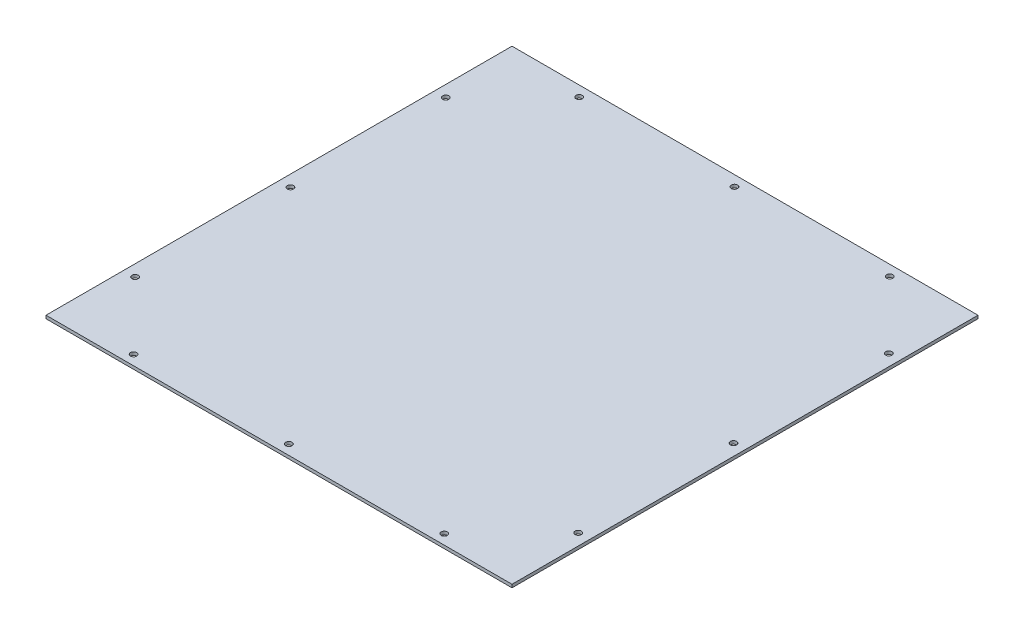
ISO-10303-21;
HEADER;
FILE_DESCRIPTION(('STEP AP214'),'2;1');
FILE_NAME('part.step','',(''),(''),'','','');
FILE_SCHEMA(('AUTOMOTIVE_DESIGN { 1 0 10303 214 1 1 1 1 }'));
ENDSEC;
DATA;
#1=APPLICATION_CONTEXT('core data for automotive mechanical design processes');
#2=APPLICATION_PROTOCOL_DEFINITION('international standard','automotive_design',2000,#1);
#3=PRODUCT_CONTEXT('',#1,'mechanical');
#4=PRODUCT('Part','Part','',(#3));
#5=PRODUCT_RELATED_PRODUCT_CATEGORY('part','',(#4));
#6=PRODUCT_DEFINITION_FORMATION('','',#4);
#7=PRODUCT_DEFINITION_CONTEXT('part definition',#1,'design');
#8=PRODUCT_DEFINITION('design','',#6,#7);
#9=PRODUCT_DEFINITION_SHAPE('','',#8);
#10=(LENGTH_UNIT() NAMED_UNIT(*) SI_UNIT(.MILLI.,.METRE.));
#11=(NAMED_UNIT(*) PLANE_ANGLE_UNIT() SI_UNIT($,.RADIAN.));
#12=(NAMED_UNIT(*) SI_UNIT($,.STERADIAN.) SOLID_ANGLE_UNIT());
#13=UNCERTAINTY_MEASURE_WITH_UNIT(LENGTH_MEASURE(1.E-05),#10,'distance_accuracy_value','');
#14=(GEOMETRIC_REPRESENTATION_CONTEXT(3) GLOBAL_UNCERTAINTY_ASSIGNED_CONTEXT((#13)) GLOBAL_UNIT_ASSIGNED_CONTEXT((#10,
#11,#12)) REPRESENTATION_CONTEXT('',''));
#15=CARTESIAN_POINT('',(0.,0.,0.));
#16=DIRECTION('',(0.,0.,1.));
#17=DIRECTION('',(1.,0.,0.));
#18=AXIS2_PLACEMENT_3D('',#15,#16,#17);
#19=CARTESIAN_POINT('',(-225.,3.,225.));
#20=DIRECTION('',(1.,0.,0.));
#21=DIRECTION('',(0.,0.,1.));
#22=AXIS2_PLACEMENT_3D('',#19,#20,#21);
#23=PLANE('',#22);
#24=DIRECTION('',(0.,1.,0.));
#25=VECTOR('',#24,1.);
#26=CARTESIAN_POINT('',(-225.,3.,-225.));
#27=LINE('',#26,#25);
#28=CARTESIAN_POINT('',(-225.,0.,-225.));
#29=VERTEX_POINT('',#28);
#30=CARTESIAN_POINT('',(-225.,3.,-225.));
#31=VERTEX_POINT('',#30);
#32=EDGE_CURVE('E11',#29,#31,#27,.T.);
#33=ORIENTED_EDGE('',*,*,#32,.F.);
#34=DIRECTION('',(0.,0.,-1.));
#35=VECTOR('',#34,1.);
#36=CARTESIAN_POINT('',(-225.,0.,0.));
#37=LINE('',#36,#35);
#38=CARTESIAN_POINT('',(-225.,0.,225.));
#39=VERTEX_POINT('',#38);
#40=EDGE_CURVE('E93',#29,#39,#37,.F.);
#41=ORIENTED_EDGE('',*,*,#40,.T.);
#42=DIRECTION('',(0.,1.,0.));
#43=VECTOR('',#42,1.);
#44=CARTESIAN_POINT('',(-225.,3.,225.));
#45=LINE('',#44,#43);
#46=CARTESIAN_POINT('',(-225.,3.,225.));
#47=VERTEX_POINT('',#46);
#48=EDGE_CURVE('E49',#39,#47,#45,.T.);
#49=ORIENTED_EDGE('',*,*,#48,.T.);
#50=DIRECTION('',(0.,0.,1.));
#51=VECTOR('',#50,1.);
#52=CARTESIAN_POINT('',(-225.,3.,225.));
#53=LINE('',#52,#51);
#54=EDGE_CURVE('E110',#31,#47,#53,.T.);
#55=ORIENTED_EDGE('',*,*,#54,.F.);
#56=EDGE_LOOP('',(#33,#41,#49,#55));
#57=FACE_BOUND('',#56,.T.);
#58=ADVANCED_FACE('F39',(#57),#23,.F.);
#59=CARTESIAN_POINT('',(-225.,3.,225.));
#60=DIRECTION('',(0.,0.,-1.));
#61=DIRECTION('',(1.,0.,0.));
#62=AXIS2_PLACEMENT_3D('',#59,#60,#61);
#63=PLANE('',#62);
#64=ORIENTED_EDGE('',*,*,#48,.F.);
#65=DIRECTION('',(1.,0.,0.));
#66=VECTOR('',#65,1.);
#67=CARTESIAN_POINT('',(0.,0.,225.));
#68=LINE('',#67,#66);
#69=CARTESIAN_POINT('',(225.,0.,225.));
#70=VERTEX_POINT('',#69);
#71=EDGE_CURVE('E104',#39,#70,#68,.T.);
#72=ORIENTED_EDGE('',*,*,#71,.T.);
#73=DIRECTION('',(0.,1.,0.));
#74=VECTOR('',#73,1.);
#75=CARTESIAN_POINT('',(225.,3.,225.));
#76=LINE('',#75,#74);
#77=CARTESIAN_POINT('',(225.,3.,225.));
#78=VERTEX_POINT('',#77);
#79=EDGE_CURVE('E57',#70,#78,#76,.T.);
#80=ORIENTED_EDGE('',*,*,#79,.T.);
#81=DIRECTION('',(1.,0.,0.));
#82=VECTOR('',#81,1.);
#83=CARTESIAN_POINT('',(-225.,3.,225.));
#84=LINE('',#83,#82);
#85=EDGE_CURVE('E87',#47,#78,#84,.T.);
#86=ORIENTED_EDGE('',*,*,#85,.F.);
#87=EDGE_LOOP('',(#64,#72,#80,#86));
#88=FACE_BOUND('',#87,.T.);
#89=ADVANCED_FACE('F114',(#88),#63,.F.);
#90=CARTESIAN_POINT('',(225.,3.,225.));
#91=DIRECTION('',(-1.,0.,0.));
#92=DIRECTION('',(0.,0.,-1.));
#93=AXIS2_PLACEMENT_3D('',#90,#91,#92);
#94=PLANE('',#93);
#95=ORIENTED_EDGE('',*,*,#79,.F.);
#96=DIRECTION('',(0.,0.,-1.));
#97=VECTOR('',#96,1.);
#98=CARTESIAN_POINT('',(225.,0.,0.));
#99=LINE('',#98,#97);
#100=CARTESIAN_POINT('',(225.,0.,-225.));
#101=VERTEX_POINT('',#100);
#102=EDGE_CURVE('E92',#70,#101,#99,.T.);
#103=ORIENTED_EDGE('',*,*,#102,.T.);
#104=DIRECTION('',(0.,1.,0.));
#105=VECTOR('',#104,1.);
#106=CARTESIAN_POINT('',(225.,3.,-225.));
#107=LINE('',#106,#105);
#108=CARTESIAN_POINT('',(225.,3.,-225.));
#109=VERTEX_POINT('',#108);
#110=EDGE_CURVE('E43',#101,#109,#107,.T.);
#111=ORIENTED_EDGE('',*,*,#110,.T.);
#112=DIRECTION('',(0.,0.,-1.));
#113=VECTOR('',#112,1.);
#114=CARTESIAN_POINT('',(225.,3.,225.));
#115=LINE('',#114,#113);
#116=EDGE_CURVE('E106',#78,#109,#115,.T.);
#117=ORIENTED_EDGE('',*,*,#116,.F.);
#118=EDGE_LOOP('',(#95,#103,#111,#117));
#119=FACE_BOUND('',#118,.T.);
#120=ADVANCED_FACE('F95',(#119),#94,.F.);
#121=CARTESIAN_POINT('',(-225.,3.,-225.));
#122=DIRECTION('',(0.,0.,1.));
#123=DIRECTION('',(-1.,0.,0.));
#124=AXIS2_PLACEMENT_3D('',#121,#122,#123);
#125=PLANE('',#124);
#126=DIRECTION('',(1.,0.,0.));
#127=VECTOR('',#126,1.);
#128=CARTESIAN_POINT('',(0.,0.,-225.));
#129=LINE('',#128,#127);
#130=EDGE_CURVE('E81',#101,#29,#129,.F.);
#131=ORIENTED_EDGE('',*,*,#130,.T.);
#132=ORIENTED_EDGE('',*,*,#32,.T.);
#133=DIRECTION('',(-1.,0.,0.));
#134=VECTOR('',#133,1.);
#135=CARTESIAN_POINT('',(-225.,3.,-225.));
#136=LINE('',#135,#134);
#137=EDGE_CURVE('E83',#109,#31,#136,.T.);
#138=ORIENTED_EDGE('',*,*,#137,.F.);
#139=ORIENTED_EDGE('',*,*,#110,.F.);
#140=EDGE_LOOP('',(#131,#132,#138,#139));
#141=FACE_BOUND('',#140,.T.);
#142=ADVANCED_FACE('F41',(#141),#125,.F.);
#143=CARTESIAN_POINT('',(0.,3.,0.));
#144=DIRECTION('',(0.,-1.,0.));
#145=DIRECTION('',(0.,0.,-1.));
#146=AXIS2_PLACEMENT_3D('',#143,#144,#145);
#147=PLANE('',#146);
#148=CARTESIAN_POINT('',(-213.95,3.,-150.));
#149=DIRECTION('',(0.,1.,0.));
#150=DIRECTION('',(0.,0.,-1.));
#151=AXIS2_PLACEMENT_3D('',#148,#149,#150);
#152=CIRCLE('',#151,2.99999999999999);
#153=CARTESIAN_POINT('',(-213.95,3.,-153.));
#154=VERTEX_POINT('',#153);
#155=EDGE_CURVE('E246',#154,#154,#152,.T.);
#156=ORIENTED_EDGE('',*,*,#155,.F.);
#157=EDGE_LOOP('',(#156));
#158=FACE_BOUND('',#157,.T.);
#159=CARTESIAN_POINT('',(-213.94999960393,3.,0.));
#160=DIRECTION('',(0.,1.,0.));
#161=DIRECTION('',(0.,0.,-1.));
#162=AXIS2_PLACEMENT_3D('',#159,#160,#161);
#163=CIRCLE('',#162,2.99999999999999);
#164=CARTESIAN_POINT('',(-213.94999960393,3.,-3.00000000000002));
#165=VERTEX_POINT('',#164);
#166=EDGE_CURVE('E240',#165,#165,#163,.T.);
#167=ORIENTED_EDGE('',*,*,#166,.F.);
#168=EDGE_LOOP('',(#167));
#169=FACE_BOUND('',#168,.T.);
#170=CARTESIAN_POINT('',(-213.949999801965,3.,150.));
#171=DIRECTION('',(0.,1.,0.));
#172=DIRECTION('',(0.,0.,-1.));
#173=AXIS2_PLACEMENT_3D('',#170,#171,#172);
#174=CIRCLE('',#173,2.99999999999999);
#175=CARTESIAN_POINT('',(-213.949999801965,3.,147.));
#176=VERTEX_POINT('',#175);
#177=EDGE_CURVE('E234',#176,#176,#174,.T.);
#178=ORIENTED_EDGE('',*,*,#177,.F.);
#179=EDGE_LOOP('',(#178));
#180=FACE_BOUND('',#179,.T.);
#181=CARTESIAN_POINT('',(0.,3.,-214.83));
#182=DIRECTION('',(0.,1.,0.));
#183=DIRECTION('',(0.,0.,1.));
#184=AXIS2_PLACEMENT_3D('',#181,#182,#183);
#185=CIRCLE('',#184,3.);
#186=CARTESIAN_POINT('',(0.,3.,-211.83));
#187=VERTEX_POINT('',#186);
#188=EDGE_CURVE('E212',#187,#187,#185,.T.);
#189=ORIENTED_EDGE('',*,*,#188,.F.);
#190=EDGE_LOOP('',(#189));
#191=FACE_BOUND('',#190,.T.);
#192=CARTESIAN_POINT('',(150.,3.,-214.83));
#193=DIRECTION('',(0.,1.,0.));
#194=DIRECTION('',(0.,0.,1.));
#195=AXIS2_PLACEMENT_3D('',#192,#193,#194);
#196=CIRCLE('',#195,2.99999999999999);
#197=CARTESIAN_POINT('',(150.,3.,-211.83));
#198=VERTEX_POINT('',#197);
#199=EDGE_CURVE('E218',#198,#198,#196,.T.);
#200=ORIENTED_EDGE('',*,*,#199,.F.);
#201=EDGE_LOOP('',(#200));
#202=FACE_BOUND('',#201,.T.);
#203=CARTESIAN_POINT('',(150.,3.,215.42));
#204=DIRECTION('',(0.,1.,0.));
#205=DIRECTION('',(0.,0.,-1.));
#206=AXIS2_PLACEMENT_3D('',#203,#204,#205);
#207=CIRCLE('',#206,2.99999999999999);
#208=CARTESIAN_POINT('',(150.,3.,212.42));
#209=VERTEX_POINT('',#208);
#210=EDGE_CURVE('E224',#209,#209,#207,.T.);
#211=ORIENTED_EDGE('',*,*,#210,.F.);
#212=EDGE_LOOP('',(#211));
#213=FACE_BOUND('',#212,.T.);
#214=CARTESIAN_POINT('',(-4.16333634234434E-13,3.,215.420006428616));
#215=DIRECTION('',(0.,1.,0.));
#216=DIRECTION('',(0.,0.,-1.));
#217=AXIS2_PLACEMENT_3D('',#214,#215,#216);
#218=CIRCLE('',#217,3.);
#219=CARTESIAN_POINT('',(-4.16333634234434E-13,3.,212.420006428616));
#220=VERTEX_POINT('',#219);
#221=EDGE_CURVE('E200',#220,#220,#218,.T.);
#222=ORIENTED_EDGE('',*,*,#221,.F.);
#223=EDGE_LOOP('',(#222));
#224=FACE_BOUND('',#223,.T.);
#225=CARTESIAN_POINT('',(213.949999998453,3.,150.));
#226=DIRECTION('',(0.,1.,0.));
#227=DIRECTION('',(0.,0.,1.));
#228=AXIS2_PLACEMENT_3D('',#225,#226,#227);
#229=CIRCLE('',#228,2.99999999999999);
#230=CARTESIAN_POINT('',(213.949999998453,3.,153.));
#231=VERTEX_POINT('',#230);
#232=EDGE_CURVE('E191',#231,#231,#229,.T.);
#233=ORIENTED_EDGE('',*,*,#232,.F.);
#234=EDGE_LOOP('',(#233));
#235=FACE_BOUND('',#234,.T.);
#236=CARTESIAN_POINT('',(213.949999998453,3.,0.));
#237=DIRECTION('',(0.,1.,0.));
#238=DIRECTION('',(0.,0.,1.));
#239=AXIS2_PLACEMENT_3D('',#236,#237,#238);
#240=CIRCLE('',#239,2.99999999999999);
#241=CARTESIAN_POINT('',(213.949999998453,3.,2.99999999999997));
#242=VERTEX_POINT('',#241);
#243=EDGE_CURVE('E184',#242,#242,#240,.T.);
#244=ORIENTED_EDGE('',*,*,#243,.F.);
#245=EDGE_LOOP('',(#244));
#246=FACE_BOUND('',#245,.T.);
#247=CARTESIAN_POINT('',(213.95,3.,-150.));
#248=DIRECTION('',(0.,1.,0.));
#249=DIRECTION('',(0.,0.,1.));
#250=AXIS2_PLACEMENT_3D('',#247,#248,#249);
#251=CIRCLE('',#250,2.99999999999999);
#252=CARTESIAN_POINT('',(213.95,3.,-147.));
#253=VERTEX_POINT('',#252);
#254=EDGE_CURVE('E188',#253,#253,#251,.T.);
#255=ORIENTED_EDGE('',*,*,#254,.F.);
#256=EDGE_LOOP('',(#255));
#257=FACE_BOUND('',#256,.T.);
#258=CARTESIAN_POINT('',(-150.,3.,215.420006428616));
#259=DIRECTION('',(0.,1.,0.));
#260=DIRECTION('',(0.,0.,-1.));
#261=AXIS2_PLACEMENT_3D('',#258,#259,#260);
#262=CIRCLE('',#261,2.99999999999999);
#263=CARTESIAN_POINT('',(-150.,3.,212.420006428616));
#264=VERTEX_POINT('',#263);
#265=EDGE_CURVE('E201',#264,#264,#262,.T.);
#266=ORIENTED_EDGE('',*,*,#265,.F.);
#267=EDGE_LOOP('',(#266));
#268=FACE_BOUND('',#267,.T.);
#269=CARTESIAN_POINT('',(-150.,3.,-214.83));
#270=DIRECTION('',(0.,1.,0.));
#271=DIRECTION('',(0.,0.,1.));
#272=AXIS2_PLACEMENT_3D('',#269,#270,#271);
#273=CIRCLE('',#272,2.99999999999999);
#274=CARTESIAN_POINT('',(-150.,3.,-211.83));
#275=VERTEX_POINT('',#274);
#276=EDGE_CURVE('E99',#275,#275,#273,.T.);
#277=ORIENTED_EDGE('',*,*,#276,.F.);
#278=EDGE_LOOP('',(#277));
#279=FACE_BOUND('',#278,.T.);
#280=ORIENTED_EDGE('',*,*,#116,.T.);
#281=ORIENTED_EDGE('',*,*,#137,.T.);
#282=ORIENTED_EDGE('',*,*,#54,.T.);
#283=ORIENTED_EDGE('',*,*,#85,.T.);
#284=EDGE_LOOP('',(#280,#281,#282,#283));
#285=FACE_BOUND('',#284,.T.);
#286=ADVANCED_FACE('F113',(#158,#169,#180,#191,#202,#213,#224,#235,#246,#257,#268,#279,#285),
#147,.F.);
#287=CARTESIAN_POINT('',(0.,0.,0.));
#288=DIRECTION('',(0.,-1.,0.));
#289=DIRECTION('',(0.,0.,-1.));
#290=AXIS2_PLACEMENT_3D('',#287,#288,#289);
#291=PLANE('',#290);
#292=CARTESIAN_POINT('',(-213.95,0.,-150.));
#293=DIRECTION('',(0.,1.,0.));
#294=DIRECTION('',(0.,0.,-1.));
#295=AXIS2_PLACEMENT_3D('',#292,#293,#294);
#296=CIRCLE('',#295,2.99999999999999);
#297=CARTESIAN_POINT('',(-213.95,0.,-153.));
#298=VERTEX_POINT('',#297);
#299=EDGE_CURVE('E243',#298,#298,#296,.T.);
#300=ORIENTED_EDGE('',*,*,#299,.T.);
#301=EDGE_LOOP('',(#300));
#302=FACE_BOUND('',#301,.T.);
#303=CARTESIAN_POINT('',(-213.94999960393,0.,0.));
#304=DIRECTION('',(0.,1.,0.));
#305=DIRECTION('',(0.,0.,-1.));
#306=AXIS2_PLACEMENT_3D('',#303,#304,#305);
#307=CIRCLE('',#306,2.99999999999999);
#308=CARTESIAN_POINT('',(-213.94999960393,0.,-3.00000000000002));
#309=VERTEX_POINT('',#308);
#310=EDGE_CURVE('E237',#309,#309,#307,.T.);
#311=ORIENTED_EDGE('',*,*,#310,.T.);
#312=EDGE_LOOP('',(#311));
#313=FACE_BOUND('',#312,.T.);
#314=CARTESIAN_POINT('',(-213.949999801965,0.,150.));
#315=DIRECTION('',(0.,1.,0.));
#316=DIRECTION('',(0.,0.,-1.));
#317=AXIS2_PLACEMENT_3D('',#314,#315,#316);
#318=CIRCLE('',#317,2.99999999999999);
#319=CARTESIAN_POINT('',(-213.949999801965,0.,147.));
#320=VERTEX_POINT('',#319);
#321=EDGE_CURVE('E196',#320,#320,#318,.T.);
#322=ORIENTED_EDGE('',*,*,#321,.T.);
#323=EDGE_LOOP('',(#322));
#324=FACE_BOUND('',#323,.T.);
#325=CARTESIAN_POINT('',(0.,0.,-214.83));
#326=DIRECTION('',(0.,1.,0.));
#327=DIRECTION('',(0.,0.,1.));
#328=AXIS2_PLACEMENT_3D('',#325,#326,#327);
#329=CIRCLE('',#328,3.);
#330=CARTESIAN_POINT('',(0.,0.,-211.83));
#331=VERTEX_POINT('',#330);
#332=EDGE_CURVE('E209',#331,#331,#329,.T.);
#333=ORIENTED_EDGE('',*,*,#332,.T.);
#334=EDGE_LOOP('',(#333));
#335=FACE_BOUND('',#334,.T.);
#336=CARTESIAN_POINT('',(150.,0.,-214.83));
#337=DIRECTION('',(0.,1.,0.));
#338=DIRECTION('',(0.,0.,1.));
#339=AXIS2_PLACEMENT_3D('',#336,#337,#338);
#340=CIRCLE('',#339,2.99999999999999);
#341=CARTESIAN_POINT('',(150.,0.,-211.83));
#342=VERTEX_POINT('',#341);
#343=EDGE_CURVE('E215',#342,#342,#340,.T.);
#344=ORIENTED_EDGE('',*,*,#343,.T.);
#345=EDGE_LOOP('',(#344));
#346=FACE_BOUND('',#345,.T.);
#347=CARTESIAN_POINT('',(150.,0.,215.42));
#348=DIRECTION('',(0.,1.,0.));
#349=DIRECTION('',(0.,0.,-1.));
#350=AXIS2_PLACEMENT_3D('',#347,#348,#349);
#351=CIRCLE('',#350,2.99999999999999);
#352=CARTESIAN_POINT('',(150.,0.,212.42));
#353=VERTEX_POINT('',#352);
#354=EDGE_CURVE('E221',#353,#353,#351,.T.);
#355=ORIENTED_EDGE('',*,*,#354,.T.);
#356=EDGE_LOOP('',(#355));
#357=FACE_BOUND('',#356,.T.);
#358=CARTESIAN_POINT('',(-4.16333634234434E-13,0.,215.420006428616));
#359=DIRECTION('',(0.,1.,0.));
#360=DIRECTION('',(0.,0.,-1.));
#361=AXIS2_PLACEMENT_3D('',#358,#359,#360);
#362=CIRCLE('',#361,3.);
#363=CARTESIAN_POINT('',(-4.16333634234434E-13,0.,212.420006428616));
#364=VERTEX_POINT('',#363);
#365=EDGE_CURVE('E227',#364,#364,#362,.T.);
#366=ORIENTED_EDGE('',*,*,#365,.T.);
#367=EDGE_LOOP('',(#366));
#368=FACE_BOUND('',#367,.T.);
#369=CARTESIAN_POINT('',(213.949999998453,0.,150.));
#370=DIRECTION('',(0.,1.,0.));
#371=DIRECTION('',(0.,0.,1.));
#372=AXIS2_PLACEMENT_3D('',#369,#370,#371);
#373=CIRCLE('',#372,2.99999999999999);
#374=CARTESIAN_POINT('',(213.949999998453,0.,153.));
#375=VERTEX_POINT('',#374);
#376=EDGE_CURVE('E186',#375,#375,#373,.T.);
#377=ORIENTED_EDGE('',*,*,#376,.T.);
#378=EDGE_LOOP('',(#377));
#379=FACE_BOUND('',#378,.T.);
#380=CARTESIAN_POINT('',(213.949999998453,0.,0.));
#381=DIRECTION('',(0.,1.,0.));
#382=DIRECTION('',(0.,0.,1.));
#383=AXIS2_PLACEMENT_3D('',#380,#381,#382);
#384=CIRCLE('',#383,2.99999999999999);
#385=CARTESIAN_POINT('',(213.949999998453,0.,2.99999999999997));
#386=VERTEX_POINT('',#385);
#387=EDGE_CURVE('E181',#386,#386,#384,.T.);
#388=ORIENTED_EDGE('',*,*,#387,.T.);
#389=EDGE_LOOP('',(#388));
#390=FACE_BOUND('',#389,.T.);
#391=CARTESIAN_POINT('',(213.95,0.,-150.));
#392=DIRECTION('',(0.,1.,0.));
#393=DIRECTION('',(0.,0.,1.));
#394=AXIS2_PLACEMENT_3D('',#391,#392,#393);
#395=CIRCLE('',#394,2.99999999999999);
#396=CARTESIAN_POINT('',(213.95,0.,-147.));
#397=VERTEX_POINT('',#396);
#398=EDGE_CURVE('E204',#397,#397,#395,.T.);
#399=ORIENTED_EDGE('',*,*,#398,.T.);
#400=EDGE_LOOP('',(#399));
#401=FACE_BOUND('',#400,.T.);
#402=CARTESIAN_POINT('',(-150.,0.,215.420006428616));
#403=DIRECTION('',(0.,1.,0.));
#404=DIRECTION('',(0.,0.,-1.));
#405=AXIS2_PLACEMENT_3D('',#402,#403,#404);
#406=CIRCLE('',#405,2.99999999999999);
#407=CARTESIAN_POINT('',(-150.,0.,212.420006428616));
#408=VERTEX_POINT('',#407);
#409=EDGE_CURVE('E197',#408,#408,#406,.T.);
#410=ORIENTED_EDGE('',*,*,#409,.T.);
#411=EDGE_LOOP('',(#410));
#412=FACE_BOUND('',#411,.T.);
#413=CARTESIAN_POINT('',(-150.,0.,-214.83));
#414=DIRECTION('',(0.,1.,0.));
#415=DIRECTION('',(0.,0.,1.));
#416=AXIS2_PLACEMENT_3D('',#413,#414,#415);
#417=CIRCLE('',#416,2.99999999999999);
#418=CARTESIAN_POINT('',(-150.,0.,-211.83));
#419=VERTEX_POINT('',#418);
#420=EDGE_CURVE('E96',#419,#419,#417,.T.);
#421=ORIENTED_EDGE('',*,*,#420,.T.);
#422=EDGE_LOOP('',(#421));
#423=FACE_BOUND('',#422,.T.);
#424=ORIENTED_EDGE('',*,*,#102,.F.);
#425=ORIENTED_EDGE('',*,*,#71,.F.);
#426=ORIENTED_EDGE('',*,*,#40,.F.);
#427=ORIENTED_EDGE('',*,*,#130,.F.);
#428=EDGE_LOOP('',(#424,#425,#426,#427));
#429=FACE_BOUND('',#428,.T.);
#430=ADVANCED_FACE('F90',(#302,#313,#324,#335,#346,#357,#368,#379,#390,#401,#412,#423,#429),
#291,.T.);
#431=CARTESIAN_POINT('',(-150.,0.,-214.83));
#432=DIRECTION('',(0.,1.,0.));
#433=DIRECTION('',(0.,0.,1.));
#434=AXIS2_PLACEMENT_3D('',#431,#432,#433);
#435=CYLINDRICAL_SURFACE('',#434,2.99999999999999);
#436=ORIENTED_EDGE('',*,*,#420,.F.);
#437=EDGE_LOOP('',(#436));
#438=FACE_BOUND('',#437,.T.);
#439=ORIENTED_EDGE('',*,*,#276,.T.);
#440=EDGE_LOOP('',(#439));
#441=FACE_BOUND('',#440,.T.);
#442=ADVANCED_FACE('F125',(#438,#441),#435,.F.);
#443=CARTESIAN_POINT('',(-150.,0.,215.420006428616));
#444=DIRECTION('',(0.,1.,0.));
#445=DIRECTION('',(0.,0.,1.));
#446=AXIS2_PLACEMENT_3D('',#443,#444,#445);
#447=CYLINDRICAL_SURFACE('',#446,2.99999999999999);
#448=ORIENTED_EDGE('',*,*,#409,.F.);
#449=EDGE_LOOP('',(#448));
#450=FACE_BOUND('',#449,.T.);
#451=ORIENTED_EDGE('',*,*,#265,.T.);
#452=EDGE_LOOP('',(#451));
#453=FACE_BOUND('',#452,.T.);
#454=ADVANCED_FACE('F132',(#450,#453),#447,.F.);
#455=CARTESIAN_POINT('',(213.95,0.,-150.));
#456=DIRECTION('',(0.,1.,0.));
#457=DIRECTION('',(0.,0.,1.));
#458=AXIS2_PLACEMENT_3D('',#455,#456,#457);
#459=CYLINDRICAL_SURFACE('',#458,2.99999999999999);
#460=ORIENTED_EDGE('',*,*,#398,.F.);
#461=EDGE_LOOP('',(#460));
#462=FACE_BOUND('',#461,.T.);
#463=ORIENTED_EDGE('',*,*,#254,.T.);
#464=EDGE_LOOP('',(#463));
#465=FACE_BOUND('',#464,.T.);
#466=ADVANCED_FACE('F163',(#462,#465),#459,.F.);
#467=CARTESIAN_POINT('',(213.949999998453,0.,0.));
#468=DIRECTION('',(0.,1.,0.));
#469=DIRECTION('',(0.,0.,1.));
#470=AXIS2_PLACEMENT_3D('',#467,#468,#469);
#471=CYLINDRICAL_SURFACE('',#470,2.99999999999999);
#472=ORIENTED_EDGE('',*,*,#387,.F.);
#473=EDGE_LOOP('',(#472));
#474=FACE_BOUND('',#473,.T.);
#475=ORIENTED_EDGE('',*,*,#243,.T.);
#476=EDGE_LOOP('',(#475));
#477=FACE_BOUND('',#476,.T.);
#478=ADVANCED_FACE('F166',(#474,#477),#471,.F.);
#479=CARTESIAN_POINT('',(213.949999998453,0.,150.));
#480=DIRECTION('',(0.,1.,0.));
#481=DIRECTION('',(0.,0.,1.));
#482=AXIS2_PLACEMENT_3D('',#479,#480,#481);
#483=CYLINDRICAL_SURFACE('',#482,2.99999999999999);
#484=ORIENTED_EDGE('',*,*,#376,.F.);
#485=EDGE_LOOP('',(#484));
#486=FACE_BOUND('',#485,.T.);
#487=ORIENTED_EDGE('',*,*,#232,.T.);
#488=EDGE_LOOP('',(#487));
#489=FACE_BOUND('',#488,.T.);
#490=ADVANCED_FACE('F151',(#486,#489),#483,.F.);
#491=CARTESIAN_POINT('',(-4.16333634234434E-13,0.,215.420006428616));
#492=DIRECTION('',(0.,1.,0.));
#493=DIRECTION('',(0.,0.,1.));
#494=AXIS2_PLACEMENT_3D('',#491,#492,#493);
#495=CYLINDRICAL_SURFACE('',#494,3.);
#496=ORIENTED_EDGE('',*,*,#365,.F.);
#497=EDGE_LOOP('',(#496));
#498=FACE_BOUND('',#497,.T.);
#499=ORIENTED_EDGE('',*,*,#221,.T.);
#500=EDGE_LOOP('',(#499));
#501=FACE_BOUND('',#500,.T.);
#502=ADVANCED_FACE('F147',(#498,#501),#495,.F.);
#503=CARTESIAN_POINT('',(150.,0.,215.42));
#504=DIRECTION('',(0.,1.,0.));
#505=DIRECTION('',(0.,0.,1.));
#506=AXIS2_PLACEMENT_3D('',#503,#504,#505);
#507=CYLINDRICAL_SURFACE('',#506,2.99999999999999);
#508=ORIENTED_EDGE('',*,*,#354,.F.);
#509=EDGE_LOOP('',(#508));
#510=FACE_BOUND('',#509,.T.);
#511=ORIENTED_EDGE('',*,*,#210,.T.);
#512=EDGE_LOOP('',(#511));
#513=FACE_BOUND('',#512,.T.);
#514=ADVANCED_FACE('F150',(#510,#513),#507,.F.);
#515=CARTESIAN_POINT('',(150.,0.,-214.83));
#516=DIRECTION('',(0.,1.,0.));
#517=DIRECTION('',(0.,0.,1.));
#518=AXIS2_PLACEMENT_3D('',#515,#516,#517);
#519=CYLINDRICAL_SURFACE('',#518,2.99999999999999);
#520=ORIENTED_EDGE('',*,*,#343,.F.);
#521=EDGE_LOOP('',(#520));
#522=FACE_BOUND('',#521,.T.);
#523=ORIENTED_EDGE('',*,*,#199,.T.);
#524=EDGE_LOOP('',(#523));
#525=FACE_BOUND('',#524,.T.);
#526=ADVANCED_FACE('F155',(#522,#525),#519,.F.);
#527=CARTESIAN_POINT('',(0.,0.,-214.83));
#528=DIRECTION('',(0.,1.,0.));
#529=DIRECTION('',(0.,0.,1.));
#530=AXIS2_PLACEMENT_3D('',#527,#528,#529);
#531=CYLINDRICAL_SURFACE('',#530,3.);
#532=ORIENTED_EDGE('',*,*,#332,.F.);
#533=EDGE_LOOP('',(#532));
#534=FACE_BOUND('',#533,.T.);
#535=ORIENTED_EDGE('',*,*,#188,.T.);
#536=EDGE_LOOP('',(#535));
#537=FACE_BOUND('',#536,.T.);
#538=ADVANCED_FACE('F145',(#534,#537),#531,.F.);
#539=CARTESIAN_POINT('',(-213.949999801965,0.,150.));
#540=DIRECTION('',(0.,1.,0.));
#541=DIRECTION('',(0.,0.,1.));
#542=AXIS2_PLACEMENT_3D('',#539,#540,#541);
#543=CYLINDRICAL_SURFACE('',#542,2.99999999999999);
#544=ORIENTED_EDGE('',*,*,#321,.F.);
#545=EDGE_LOOP('',(#544));
#546=FACE_BOUND('',#545,.T.);
#547=ORIENTED_EDGE('',*,*,#177,.T.);
#548=EDGE_LOOP('',(#547));
#549=FACE_BOUND('',#548,.T.);
#550=ADVANCED_FACE('F141',(#546,#549),#543,.F.);
#551=CARTESIAN_POINT('',(-213.94999960393,0.,0.));
#552=DIRECTION('',(0.,1.,0.));
#553=DIRECTION('',(0.,0.,1.));
#554=AXIS2_PLACEMENT_3D('',#551,#552,#553);
#555=CYLINDRICAL_SURFACE('',#554,2.99999999999999);
#556=ORIENTED_EDGE('',*,*,#310,.F.);
#557=EDGE_LOOP('',(#556));
#558=FACE_BOUND('',#557,.T.);
#559=ORIENTED_EDGE('',*,*,#166,.T.);
#560=EDGE_LOOP('',(#559));
#561=FACE_BOUND('',#560,.T.);
#562=ADVANCED_FACE('F137',(#558,#561),#555,.F.);
#563=CARTESIAN_POINT('',(-213.95,0.,-150.));
#564=DIRECTION('',(0.,1.,0.));
#565=DIRECTION('',(0.,0.,1.));
#566=AXIS2_PLACEMENT_3D('',#563,#564,#565);
#567=CYLINDRICAL_SURFACE('',#566,2.99999999999999);
#568=ORIENTED_EDGE('',*,*,#299,.F.);
#569=EDGE_LOOP('',(#568));
#570=FACE_BOUND('',#569,.T.);
#571=ORIENTED_EDGE('',*,*,#155,.T.);
#572=EDGE_LOOP('',(#571));
#573=FACE_BOUND('',#572,.T.);
#574=ADVANCED_FACE('F134',(#570,#573),#567,.F.);
#575=CLOSED_SHELL('',(#58,#89,#120,#142,#286,#430,#442,#454,#466,#478,#490,#502,#514,#526,#538,
#550,#562,#574));
#576=MANIFOLD_SOLID_BREP('B2',#575);
#577=ADVANCED_BREP_SHAPE_REPRESENTATION('',(#18,#576),#14);
#578=SHAPE_DEFINITION_REPRESENTATION(#9,#577);
ENDSEC;
END-ISO-10303-21;
